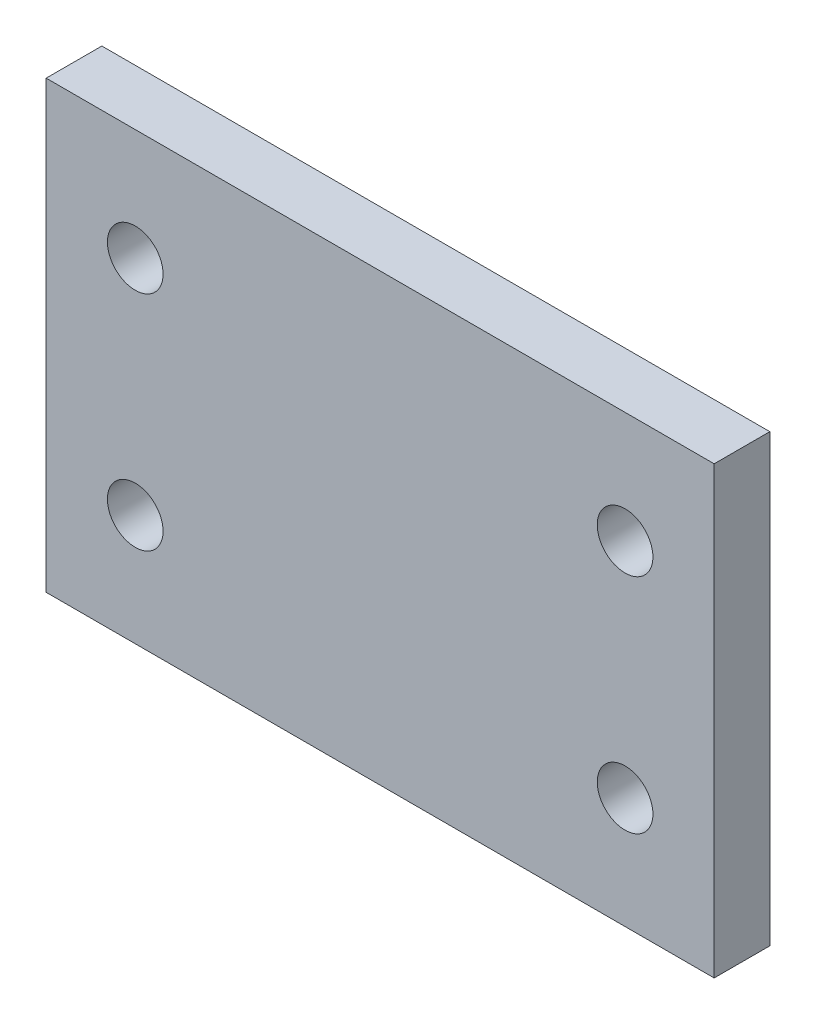
ISO-10303-21;
HEADER;
FILE_DESCRIPTION(('STEP AP214'),'2;1');
FILE_NAME('part.step','',(''),(''),'','','');
FILE_SCHEMA(('AUTOMOTIVE_DESIGN { 1 0 10303 214 1 1 1 1 }'));
ENDSEC;
DATA;
#1=APPLICATION_CONTEXT('core data for automotive mechanical design processes');
#2=APPLICATION_PROTOCOL_DEFINITION('international standard','automotive_design',2000,#1);
#3=PRODUCT_CONTEXT('',#1,'mechanical');
#4=PRODUCT('Part','Part','',(#3));
#5=PRODUCT_RELATED_PRODUCT_CATEGORY('part','',(#4));
#6=PRODUCT_DEFINITION_FORMATION('','',#4);
#7=PRODUCT_DEFINITION_CONTEXT('part definition',#1,'design');
#8=PRODUCT_DEFINITION('design','',#6,#7);
#9=PRODUCT_DEFINITION_SHAPE('','',#8);
#10=(LENGTH_UNIT() NAMED_UNIT(*) SI_UNIT(.MILLI.,.METRE.));
#11=(NAMED_UNIT(*) PLANE_ANGLE_UNIT() SI_UNIT($,.RADIAN.));
#12=(NAMED_UNIT(*) SI_UNIT($,.STERADIAN.) SOLID_ANGLE_UNIT());
#13=UNCERTAINTY_MEASURE_WITH_UNIT(LENGTH_MEASURE(1.E-05),#10,'distance_accuracy_value','');
#14=(GEOMETRIC_REPRESENTATION_CONTEXT(3) GLOBAL_UNCERTAINTY_ASSIGNED_CONTEXT((#13)) GLOBAL_UNIT_ASSIGNED_CONTEXT((#10,
#11,#12)) REPRESENTATION_CONTEXT('',''));
#15=CARTESIAN_POINT('',(0.,0.,0.));
#16=DIRECTION('',(0.,0.,1.));
#17=DIRECTION('',(1.,0.,0.));
#18=AXIS2_PLACEMENT_3D('',#15,#16,#17);
#19=CARTESIAN_POINT('',(0.,0.,5.));
#20=DIRECTION('',(1.,0.,0.));
#21=DIRECTION('',(0.,0.,-1.));
#22=AXIS2_PLACEMENT_3D('',#19,#20,#21);
#23=PLANE('',#22);
#24=DIRECTION('',(0.,-1.,0.));
#25=VECTOR('',#24,1.);
#26=CARTESIAN_POINT('',(0.,0.,0.));
#27=LINE('',#26,#25);
#28=CARTESIAN_POINT('',(0.,40.,0.));
#29=VERTEX_POINT('',#28);
#30=CARTESIAN_POINT('',(0.,0.,0.));
#31=VERTEX_POINT('',#30);
#32=EDGE_CURVE('E98',#29,#31,#27,.T.);
#33=ORIENTED_EDGE('',*,*,#32,.T.);
#34=DIRECTION('',(0.,0.,-1.));
#35=VECTOR('',#34,1.);
#36=CARTESIAN_POINT('',(0.,0.,5.));
#37=LINE('',#36,#35);
#38=CARTESIAN_POINT('',(0.,0.,5.));
#39=VERTEX_POINT('',#38);
#40=EDGE_CURVE('E11',#39,#31,#37,.T.);
#41=ORIENTED_EDGE('',*,*,#40,.F.);
#42=DIRECTION('',(0.,-1.,0.));
#43=VECTOR('',#42,1.);
#44=CARTESIAN_POINT('',(0.,0.,5.));
#45=LINE('',#44,#43);
#46=CARTESIAN_POINT('',(0.,40.,5.));
#47=VERTEX_POINT('',#46);
#48=EDGE_CURVE('E85',#47,#39,#45,.T.);
#49=ORIENTED_EDGE('',*,*,#48,.F.);
#50=DIRECTION('',(0.,0.,-1.));
#51=VECTOR('',#50,1.);
#52=CARTESIAN_POINT('',(0.,40.,5.));
#53=LINE('',#52,#51);
#54=EDGE_CURVE('E94',#47,#29,#53,.T.);
#55=ORIENTED_EDGE('',*,*,#54,.T.);
#56=EDGE_LOOP('',(#33,#41,#49,#55));
#57=FACE_BOUND('',#56,.T.);
#58=ADVANCED_FACE('F32',(#57),#23,.F.);
#59=CARTESIAN_POINT('',(0.,0.,5.));
#60=DIRECTION('',(0.,1.,0.));
#61=DIRECTION('',(0.,0.,1.));
#62=AXIS2_PLACEMENT_3D('',#59,#60,#61);
#63=PLANE('',#62);
#64=DIRECTION('',(1.,0.,0.));
#65=VECTOR('',#64,1.);
#66=CARTESIAN_POINT('',(0.,0.,0.));
#67=LINE('',#66,#65);
#68=CARTESIAN_POINT('',(60.,0.,0.));
#69=VERTEX_POINT('',#68);
#70=EDGE_CURVE('E89',#31,#69,#67,.T.);
#71=ORIENTED_EDGE('',*,*,#70,.T.);
#72=DIRECTION('',(0.,0.,-1.));
#73=VECTOR('',#72,1.);
#74=CARTESIAN_POINT('',(60.,0.,5.));
#75=LINE('',#74,#73);
#76=CARTESIAN_POINT('',(60.,0.,5.));
#77=VERTEX_POINT('',#76);
#78=EDGE_CURVE('E41',#77,#69,#75,.T.);
#79=ORIENTED_EDGE('',*,*,#78,.F.);
#80=DIRECTION('',(1.,0.,0.));
#81=VECTOR('',#80,1.);
#82=CARTESIAN_POINT('',(0.,0.,5.));
#83=LINE('',#82,#81);
#84=EDGE_CURVE('E80',#39,#77,#83,.T.);
#85=ORIENTED_EDGE('',*,*,#84,.F.);
#86=ORIENTED_EDGE('',*,*,#40,.T.);
#87=EDGE_LOOP('',(#71,#79,#85,#86));
#88=FACE_BOUND('',#87,.T.);
#89=ADVANCED_FACE('F88',(#88),#63,.F.);
#90=CARTESIAN_POINT('',(60.,0.,5.));
#91=DIRECTION('',(-1.,0.,0.));
#92=DIRECTION('',(0.,0.,1.));
#93=AXIS2_PLACEMENT_3D('',#90,#91,#92);
#94=PLANE('',#93);
#95=DIRECTION('',(0.,1.,0.));
#96=VECTOR('',#95,1.);
#97=CARTESIAN_POINT('',(60.,0.,0.));
#98=LINE('',#97,#96);
#99=CARTESIAN_POINT('',(60.,40.,0.));
#100=VERTEX_POINT('',#99);
#101=EDGE_CURVE('E67',#69,#100,#98,.T.);
#102=ORIENTED_EDGE('',*,*,#101,.T.);
#103=DIRECTION('',(0.,0.,-1.));
#104=VECTOR('',#103,1.);
#105=CARTESIAN_POINT('',(60.,40.,5.));
#106=LINE('',#105,#104);
#107=CARTESIAN_POINT('',(60.,40.,5.));
#108=VERTEX_POINT('',#107);
#109=EDGE_CURVE('E90',#108,#100,#106,.T.);
#110=ORIENTED_EDGE('',*,*,#109,.F.);
#111=DIRECTION('',(0.,1.,0.));
#112=VECTOR('',#111,1.);
#113=CARTESIAN_POINT('',(60.,0.,5.));
#114=LINE('',#113,#112);
#115=EDGE_CURVE('E83',#77,#108,#114,.T.);
#116=ORIENTED_EDGE('',*,*,#115,.F.);
#117=ORIENTED_EDGE('',*,*,#78,.T.);
#118=EDGE_LOOP('',(#102,#110,#116,#117));
#119=FACE_BOUND('',#118,.T.);
#120=ADVANCED_FACE('F92',(#119),#94,.F.);
#121=CARTESIAN_POINT('',(0.,40.,5.));
#122=DIRECTION('',(0.,-1.,0.));
#123=DIRECTION('',(0.,0.,-1.));
#124=AXIS2_PLACEMENT_3D('',#121,#122,#123);
#125=PLANE('',#124);
#126=DIRECTION('',(-1.,0.,0.));
#127=VECTOR('',#126,1.);
#128=CARTESIAN_POINT('',(0.,40.,0.));
#129=LINE('',#128,#127);
#130=EDGE_CURVE('E73',#100,#29,#129,.T.);
#131=ORIENTED_EDGE('',*,*,#130,.T.);
#132=ORIENTED_EDGE('',*,*,#54,.F.);
#133=DIRECTION('',(-1.,0.,0.));
#134=VECTOR('',#133,1.);
#135=CARTESIAN_POINT('',(0.,40.,5.));
#136=LINE('',#135,#134);
#137=EDGE_CURVE('E50',#108,#47,#136,.T.);
#138=ORIENTED_EDGE('',*,*,#137,.F.);
#139=ORIENTED_EDGE('',*,*,#109,.T.);
#140=EDGE_LOOP('',(#131,#132,#138,#139));
#141=FACE_BOUND('',#140,.T.);
#142=ADVANCED_FACE('F134',(#141),#125,.F.);
#143=CARTESIAN_POINT('',(0.,0.,5.));
#144=DIRECTION('',(0.,0.,-1.));
#145=DIRECTION('',(-1.,0.,0.));
#146=AXIS2_PLACEMENT_3D('',#143,#144,#145);
#147=PLANE('',#146);
#148=CARTESIAN_POINT('',(52.,30.,5.));
#149=DIRECTION('',(0.,0.,1.));
#150=DIRECTION('',(1.,0.,0.));
#151=AXIS2_PLACEMENT_3D('',#148,#149,#150);
#152=CIRCLE('',#151,2.5);
#153=CARTESIAN_POINT('',(54.5,30.,5.));
#154=VERTEX_POINT('',#153);
#155=EDGE_CURVE('E212',#154,#154,#152,.T.);
#156=ORIENTED_EDGE('',*,*,#155,.F.);
#157=EDGE_LOOP('',(#156));
#158=FACE_BOUND('',#157,.T.);
#159=CARTESIAN_POINT('',(52.,10.,5.));
#160=DIRECTION('',(0.,0.,1.));
#161=DIRECTION('',(1.,0.,0.));
#162=AXIS2_PLACEMENT_3D('',#159,#160,#161);
#163=CIRCLE('',#162,2.5);
#164=CARTESIAN_POINT('',(54.5,10.,5.));
#165=VERTEX_POINT('',#164);
#166=EDGE_CURVE('E209',#165,#165,#163,.T.);
#167=ORIENTED_EDGE('',*,*,#166,.F.);
#168=EDGE_LOOP('',(#167));
#169=FACE_BOUND('',#168,.T.);
#170=CARTESIAN_POINT('',(8.,10.,5.));
#171=DIRECTION('',(0.,0.,1.));
#172=DIRECTION('',(1.,0.,0.));
#173=AXIS2_PLACEMENT_3D('',#170,#171,#172);
#174=CIRCLE('',#173,2.5);
#175=CARTESIAN_POINT('',(10.5,10.,5.));
#176=VERTEX_POINT('',#175);
#177=EDGE_CURVE('E211',#176,#176,#174,.T.);
#178=ORIENTED_EDGE('',*,*,#177,.F.);
#179=EDGE_LOOP('',(#178));
#180=FACE_BOUND('',#179,.T.);
#181=CARTESIAN_POINT('',(8.,30.,5.));
#182=DIRECTION('',(0.,0.,1.));
#183=DIRECTION('',(1.,0.,0.));
#184=AXIS2_PLACEMENT_3D('',#181,#182,#183);
#185=CIRCLE('',#184,2.5);
#186=CARTESIAN_POINT('',(10.5,30.,5.));
#187=VERTEX_POINT('',#186);
#188=EDGE_CURVE('E110',#187,#187,#185,.T.);
#189=ORIENTED_EDGE('',*,*,#188,.F.);
#190=EDGE_LOOP('',(#189));
#191=FACE_BOUND('',#190,.T.);
#192=ORIENTED_EDGE('',*,*,#48,.T.);
#193=ORIENTED_EDGE('',*,*,#84,.T.);
#194=ORIENTED_EDGE('',*,*,#115,.T.);
#195=ORIENTED_EDGE('',*,*,#137,.T.);
#196=EDGE_LOOP('',(#192,#193,#194,#195));
#197=FACE_BOUND('',#196,.T.);
#198=ADVANCED_FACE('F81',(#158,#169,#180,#191,#197),#147,.F.);
#199=CARTESIAN_POINT('',(0.,0.,0.));
#200=DIRECTION('',(0.,0.,-1.));
#201=DIRECTION('',(-1.,0.,0.));
#202=AXIS2_PLACEMENT_3D('',#199,#200,#201);
#203=PLANE('',#202);
#204=CARTESIAN_POINT('',(52.,30.,0.));
#205=DIRECTION('',(0.,0.,-1.));
#206=DIRECTION('',(-1.,0.,0.));
#207=AXIS2_PLACEMENT_3D('',#204,#205,#206);
#208=CIRCLE('',#207,2.5);
#209=CARTESIAN_POINT('',(49.5,30.,0.));
#210=VERTEX_POINT('',#209);
#211=EDGE_CURVE('E35',#210,#210,#208,.T.);
#212=ORIENTED_EDGE('',*,*,#211,.F.);
#213=EDGE_LOOP('',(#212));
#214=FACE_BOUND('',#213,.T.);
#215=CARTESIAN_POINT('',(52.,10.,0.));
#216=DIRECTION('',(0.,0.,-1.));
#217=DIRECTION('',(-1.,0.,0.));
#218=AXIS2_PLACEMENT_3D('',#215,#216,#217);
#219=CIRCLE('',#218,2.5);
#220=CARTESIAN_POINT('',(49.5,10.,0.));
#221=VERTEX_POINT('',#220);
#222=EDGE_CURVE('E112',#221,#221,#219,.T.);
#223=ORIENTED_EDGE('',*,*,#222,.F.);
#224=EDGE_LOOP('',(#223));
#225=FACE_BOUND('',#224,.T.);
#226=CARTESIAN_POINT('',(8.,10.,0.));
#227=DIRECTION('',(0.,0.,-1.));
#228=DIRECTION('',(-1.,0.,0.));
#229=AXIS2_PLACEMENT_3D('',#226,#227,#228);
#230=CIRCLE('',#229,2.5);
#231=CARTESIAN_POINT('',(5.5,10.,0.));
#232=VERTEX_POINT('',#231);
#233=EDGE_CURVE('E109',#232,#232,#230,.T.);
#234=ORIENTED_EDGE('',*,*,#233,.F.);
#235=EDGE_LOOP('',(#234));
#236=FACE_BOUND('',#235,.T.);
#237=CARTESIAN_POINT('',(8.,30.,0.));
#238=DIRECTION('',(0.,0.,-1.));
#239=DIRECTION('',(-1.,0.,0.));
#240=AXIS2_PLACEMENT_3D('',#237,#238,#239);
#241=CIRCLE('',#240,2.5);
#242=CARTESIAN_POINT('',(5.5,30.,0.));
#243=VERTEX_POINT('',#242);
#244=EDGE_CURVE('E106',#243,#243,#241,.T.);
#245=ORIENTED_EDGE('',*,*,#244,.F.);
#246=EDGE_LOOP('',(#245));
#247=FACE_BOUND('',#246,.T.);
#248=ORIENTED_EDGE('',*,*,#32,.F.);
#249=ORIENTED_EDGE('',*,*,#130,.F.);
#250=ORIENTED_EDGE('',*,*,#101,.F.);
#251=ORIENTED_EDGE('',*,*,#70,.F.);
#252=EDGE_LOOP('',(#248,#249,#250,#251));
#253=FACE_BOUND('',#252,.T.);
#254=ADVANCED_FACE('F122',(#214,#225,#236,#247,#253),#203,.T.);
#255=CARTESIAN_POINT('',(8.,30.,-5.));
#256=DIRECTION('',(0.,0.,1.));
#257=DIRECTION('',(1.,0.,0.));
#258=AXIS2_PLACEMENT_3D('',#255,#256,#257);
#259=CYLINDRICAL_SURFACE('',#258,2.5);
#260=ORIENTED_EDGE('',*,*,#244,.T.);
#261=EDGE_LOOP('',(#260));
#262=FACE_BOUND('',#261,.T.);
#263=ORIENTED_EDGE('',*,*,#188,.T.);
#264=EDGE_LOOP('',(#263));
#265=FACE_BOUND('',#264,.T.);
#266=ADVANCED_FACE('F125',(#262,#265),#259,.F.);
#267=CARTESIAN_POINT('',(8.,10.,-5.));
#268=DIRECTION('',(0.,0.,1.));
#269=DIRECTION('',(1.,0.,0.));
#270=AXIS2_PLACEMENT_3D('',#267,#268,#269);
#271=CYLINDRICAL_SURFACE('',#270,2.5);
#272=ORIENTED_EDGE('',*,*,#233,.T.);
#273=EDGE_LOOP('',(#272));
#274=FACE_BOUND('',#273,.T.);
#275=ORIENTED_EDGE('',*,*,#177,.T.);
#276=EDGE_LOOP('',(#275));
#277=FACE_BOUND('',#276,.T.);
#278=ADVANCED_FACE('F175',(#274,#277),#271,.F.);
#279=CARTESIAN_POINT('',(52.,10.,-5.));
#280=DIRECTION('',(0.,0.,1.));
#281=DIRECTION('',(1.,0.,0.));
#282=AXIS2_PLACEMENT_3D('',#279,#280,#281);
#283=CYLINDRICAL_SURFACE('',#282,2.5);
#284=ORIENTED_EDGE('',*,*,#222,.T.);
#285=EDGE_LOOP('',(#284));
#286=FACE_BOUND('',#285,.T.);
#287=ORIENTED_EDGE('',*,*,#166,.T.);
#288=EDGE_LOOP('',(#287));
#289=FACE_BOUND('',#288,.T.);
#290=ADVANCED_FACE('F185',(#286,#289),#283,.F.);
#291=CARTESIAN_POINT('',(52.,30.,-5.));
#292=DIRECTION('',(0.,0.,1.));
#293=DIRECTION('',(1.,0.,0.));
#294=AXIS2_PLACEMENT_3D('',#291,#292,#293);
#295=CYLINDRICAL_SURFACE('',#294,2.5);
#296=ORIENTED_EDGE('',*,*,#211,.T.);
#297=EDGE_LOOP('',(#296));
#298=FACE_BOUND('',#297,.T.);
#299=ORIENTED_EDGE('',*,*,#155,.T.);
#300=EDGE_LOOP('',(#299));
#301=FACE_BOUND('',#300,.T.);
#302=ADVANCED_FACE('F119',(#298,#301),#295,.F.);
#303=CLOSED_SHELL('',(#58,#89,#120,#142,#198,#254,#266,#278,#290,#302));
#304=MANIFOLD_SOLID_BREP('B2',#303);
#305=ADVANCED_BREP_SHAPE_REPRESENTATION('',(#18,#304),#14);
#306=SHAPE_DEFINITION_REPRESENTATION(#9,#305);
ENDSEC;
END-ISO-10303-21;
